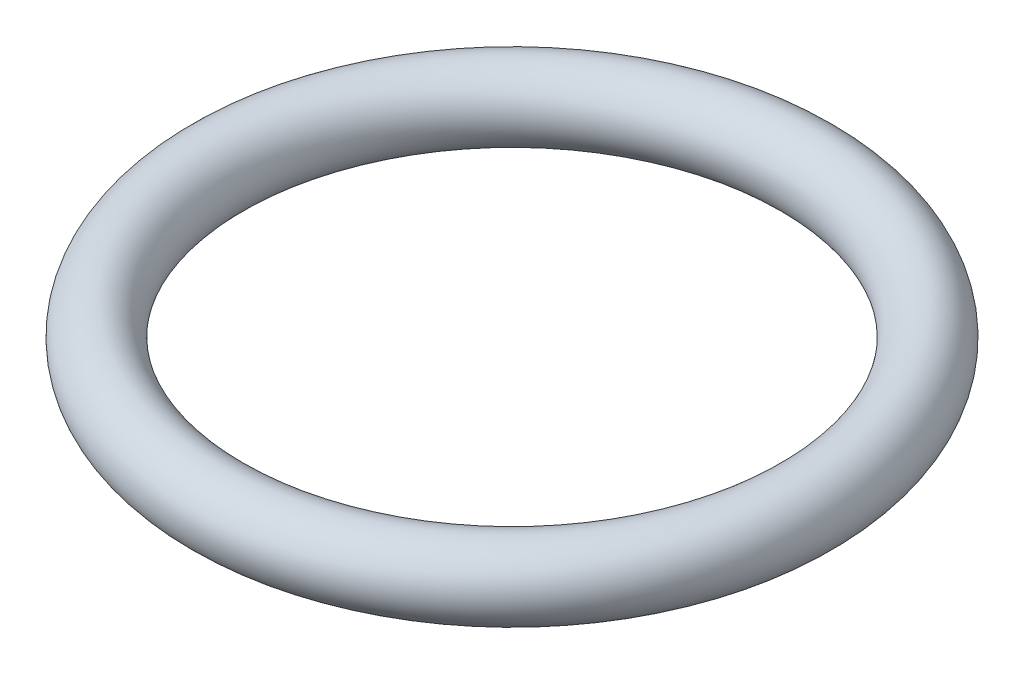
ISO-10303-21;
HEADER;
FILE_DESCRIPTION(('STEP AP214'),'2;1');
FILE_NAME('part.step','',(''),(''),'','','');
FILE_SCHEMA(('AUTOMOTIVE_DESIGN { 1 0 10303 214 1 1 1 1 }'));
ENDSEC;
DATA;
#1=APPLICATION_CONTEXT('core data for automotive mechanical design processes');
#2=APPLICATION_PROTOCOL_DEFINITION('international standard','automotive_design',2000,#1);
#3=PRODUCT_CONTEXT('',#1,'mechanical');
#4=PRODUCT('Part','Part','',(#3));
#5=PRODUCT_RELATED_PRODUCT_CATEGORY('part','',(#4));
#6=PRODUCT_DEFINITION_FORMATION('','',#4);
#7=PRODUCT_DEFINITION_CONTEXT('part definition',#1,'design');
#8=PRODUCT_DEFINITION('design','',#6,#7);
#9=PRODUCT_DEFINITION_SHAPE('','',#8);
#10=(LENGTH_UNIT() NAMED_UNIT(*) SI_UNIT(.MILLI.,.METRE.));
#11=(NAMED_UNIT(*) PLANE_ANGLE_UNIT() SI_UNIT($,.RADIAN.));
#12=(NAMED_UNIT(*) SI_UNIT($,.STERADIAN.) SOLID_ANGLE_UNIT());
#13=UNCERTAINTY_MEASURE_WITH_UNIT(LENGTH_MEASURE(1.E-05),#10,'distance_accuracy_value','');
#14=(GEOMETRIC_REPRESENTATION_CONTEXT(3) GLOBAL_UNCERTAINTY_ASSIGNED_CONTEXT((#13)) GLOBAL_UNIT_ASSIGNED_CONTEXT((#10,
#11,#12)) REPRESENTATION_CONTEXT('',''));
#15=CARTESIAN_POINT('',(0.,0.,0.));
#16=DIRECTION('',(0.,0.,1.));
#17=DIRECTION('',(1.,0.,0.));
#18=AXIS2_PLACEMENT_3D('',#15,#16,#17);
#19=CARTESIAN_POINT('',(0.,0.,0.));
#20=DIRECTION('',(0.,-1.,0.));
#21=DIRECTION('',(0.,0.,-1.));
#22=AXIS2_PLACEMENT_3D('',#19,#20,#21);
#23=TOROIDAL_SURFACE('',#22,8.25,1.);
#24=CARTESIAN_POINT('',(0.,0.,-9.25));
#25=VERTEX_POINT('',#24);
#26=VERTEX_LOOP('',#25);
#27=FACE_BOUND('',#26,.T.);
#28=ADVANCED_FACE('F33',(#27),#23,.T.);
#29=CLOSED_SHELL('',(#28));
#30=MANIFOLD_SOLID_BREP('B2',#29);
#31=ADVANCED_BREP_SHAPE_REPRESENTATION('',(#18,#30),#14);
#32=SHAPE_DEFINITION_REPRESENTATION(#9,#31);
ENDSEC;
END-ISO-10303-21;
